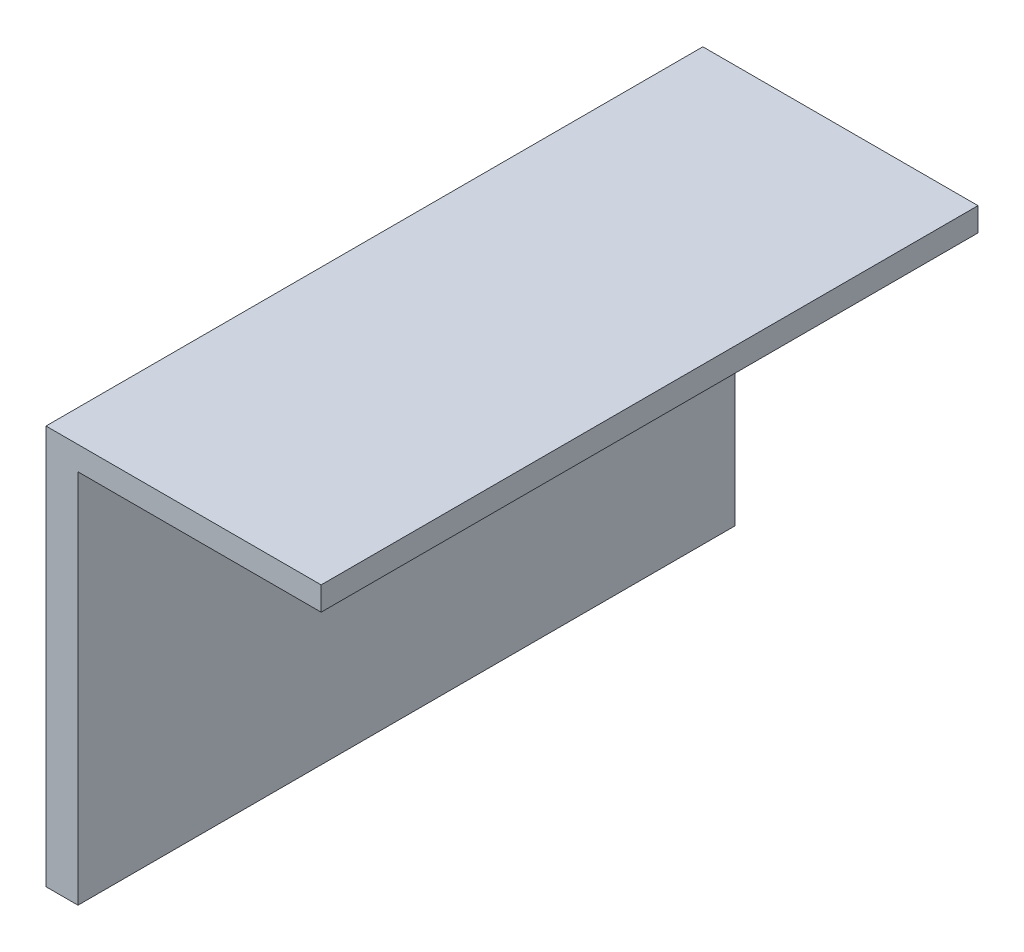
ISO-10303-21;
HEADER;
FILE_DESCRIPTION(('STEP AP214'),'2;1');
FILE_NAME('part.step','',(''),(''),'','','');
FILE_SCHEMA(('AUTOMOTIVE_DESIGN { 1 0 10303 214 1 1 1 1 }'));
ENDSEC;
DATA;
#1=APPLICATION_CONTEXT('core data for automotive mechanical design processes');
#2=APPLICATION_PROTOCOL_DEFINITION('international standard','automotive_design',2000,#1);
#3=PRODUCT_CONTEXT('',#1,'mechanical');
#4=PRODUCT('Part','Part','',(#3));
#5=PRODUCT_RELATED_PRODUCT_CATEGORY('part','',(#4));
#6=PRODUCT_DEFINITION_FORMATION('','',#4);
#7=PRODUCT_DEFINITION_CONTEXT('part definition',#1,'design');
#8=PRODUCT_DEFINITION('design','',#6,#7);
#9=PRODUCT_DEFINITION_SHAPE('','',#8);
#10=(LENGTH_UNIT() NAMED_UNIT(*) SI_UNIT(.MILLI.,.METRE.));
#11=(NAMED_UNIT(*) PLANE_ANGLE_UNIT() SI_UNIT($,.RADIAN.));
#12=(NAMED_UNIT(*) SI_UNIT($,.STERADIAN.) SOLID_ANGLE_UNIT());
#13=UNCERTAINTY_MEASURE_WITH_UNIT(LENGTH_MEASURE(1.E-05),#10,'distance_accuracy_value','');
#14=(GEOMETRIC_REPRESENTATION_CONTEXT(3) GLOBAL_UNCERTAINTY_ASSIGNED_CONTEXT((#13)) GLOBAL_UNIT_ASSIGNED_CONTEXT((#10,
#11,#12)) REPRESENTATION_CONTEXT('',''));
#15=CARTESIAN_POINT('',(0.,0.,0.));
#16=DIRECTION('',(0.,0.,1.));
#17=DIRECTION('',(1.,0.,0.));
#18=AXIS2_PLACEMENT_3D('',#15,#16,#17);
#19=CARTESIAN_POINT('',(2.54,-13.2993357801751,50.0268182689161));
#20=DIRECTION('',(0.,0.,-1.));
#21=DIRECTION('',(-1.,0.,0.));
#22=AXIS2_PLACEMENT_3D('',#19,#20,#21);
#23=PLANE('',#22);
#24=DIRECTION('',(0.,-1.,0.));
#25=VECTOR('',#24,1.);
#26=CARTESIAN_POINT('',(0.,-13.2993357801751,50.0268182689161));
#27=LINE('',#26,#25);
#28=CARTESIAN_POINT('',(0.,18.3793357798595,50.0268182689161));
#29=VERTEX_POINT('',#28);
#30=CARTESIAN_POINT('',(0.,-13.2993357801751,50.0268182689161));
#31=VERTEX_POINT('',#30);
#32=EDGE_CURVE('E97',#29,#31,#27,.T.);
#33=ORIENTED_EDGE('',*,*,#32,.T.);
#34=DIRECTION('',(-1.,0.,0.));
#35=VECTOR('',#34,1.);
#36=CARTESIAN_POINT('',(2.54,-13.2993357801751,50.0268182689161));
#37=LINE('',#36,#35);
#38=CARTESIAN_POINT('',(2.54,-13.2993357801751,50.0268182689161));
#39=VERTEX_POINT('',#38);
#40=EDGE_CURVE('E11',#39,#31,#37,.T.);
#41=ORIENTED_EDGE('',*,*,#40,.F.);
#42=DIRECTION('',(0.,-1.,0.));
#43=VECTOR('',#42,1.);
#44=CARTESIAN_POINT('',(2.54,-13.2993357801751,50.0268182689161));
#45=LINE('',#44,#43);
#46=CARTESIAN_POINT('',(2.54,16.5011553694942,50.0268182689161));
#47=VERTEX_POINT('',#46);
#48=EDGE_CURVE('E90',#47,#39,#45,.T.);
#49=ORIENTED_EDGE('',*,*,#48,.F.);
#50=DIRECTION('',(-1.,0.,0.));
#51=VECTOR('',#50,1.);
#52=CARTESIAN_POINT('',(21.844,16.5011553694942,50.0268182689161));
#53=LINE('',#52,#51);
#54=CARTESIAN_POINT('',(21.844,16.5011553694942,50.0268182689161));
#55=VERTEX_POINT('',#54);
#56=EDGE_CURVE('E107',#55,#47,#53,.T.);
#57=ORIENTED_EDGE('',*,*,#56,.F.);
#58=DIRECTION('',(0.,-1.,0.));
#59=VECTOR('',#58,1.);
#60=CARTESIAN_POINT('',(21.844,18.3793357798595,50.0268182689161));
#61=LINE('',#60,#59);
#62=CARTESIAN_POINT('',(21.844,18.3793357798595,50.0268182689161));
#63=VERTEX_POINT('',#62);
#64=EDGE_CURVE('E100',#63,#55,#61,.T.);
#65=ORIENTED_EDGE('',*,*,#64,.F.);
#66=DIRECTION('',(-1.,0.,0.));
#67=VECTOR('',#66,1.);
#68=CARTESIAN_POINT('',(2.54,18.3793357798595,50.0268182689161));
#69=LINE('',#68,#67);
#70=EDGE_CURVE('E82',#63,#29,#69,.T.);
#71=ORIENTED_EDGE('',*,*,#70,.T.);
#72=EDGE_LOOP('',(#33,#41,#49,#57,#65,#71));
#73=FACE_BOUND('',#72,.T.);
#74=ADVANCED_FACE('F37',(#73),#23,.F.);
#75=CARTESIAN_POINT('',(2.54,-13.2993357801751,-2.12253055855477));
#76=DIRECTION('',(0.,1.,0.));
#77=DIRECTION('',(0.,0.,1.));
#78=AXIS2_PLACEMENT_3D('',#75,#76,#77);
#79=PLANE('',#78);
#80=DIRECTION('',(0.,0.,-1.));
#81=VECTOR('',#80,1.);
#82=CARTESIAN_POINT('',(0.,-13.2993357801751,-2.12253055855477));
#83=LINE('',#82,#81);
#84=CARTESIAN_POINT('',(0.,-13.2993357801751,-2.12253055855477));
#85=VERTEX_POINT('',#84);
#86=EDGE_CURVE('E105',#31,#85,#83,.T.);
#87=ORIENTED_EDGE('',*,*,#86,.T.);
#88=DIRECTION('',(-1.,0.,0.));
#89=VECTOR('',#88,1.);
#90=CARTESIAN_POINT('',(2.54,-13.2993357801751,-2.12253055855477));
#91=LINE('',#90,#89);
#92=CARTESIAN_POINT('',(2.54,-13.2993357801751,-2.12253055855477));
#93=VERTEX_POINT('',#92);
#94=EDGE_CURVE('E45',#93,#85,#91,.T.);
#95=ORIENTED_EDGE('',*,*,#94,.F.);
#96=DIRECTION('',(0.,0.,-1.));
#97=VECTOR('',#96,1.);
#98=CARTESIAN_POINT('',(2.54,-13.2993357801751,-2.12253055855477));
#99=LINE('',#98,#97);
#100=EDGE_CURVE('E58',#39,#93,#99,.T.);
#101=ORIENTED_EDGE('',*,*,#100,.F.);
#102=ORIENTED_EDGE('',*,*,#40,.T.);
#103=EDGE_LOOP('',(#87,#95,#101,#102));
#104=FACE_BOUND('',#103,.T.);
#105=ADVANCED_FACE('F130',(#104),#79,.F.);
#106=CARTESIAN_POINT('',(2.54,-13.2993357801751,-2.12253055855477));
#107=DIRECTION('',(0.,0.,1.));
#108=DIRECTION('',(1.,0.,0.));
#109=AXIS2_PLACEMENT_3D('',#106,#107,#108);
#110=PLANE('',#109);
#111=DIRECTION('',(0.,1.,0.));
#112=VECTOR('',#111,1.);
#113=CARTESIAN_POINT('',(0.,-13.2993357801751,-2.12253055855477));
#114=LINE('',#113,#112);
#115=CARTESIAN_POINT('',(0.,18.3793357798595,-2.12253055855477));
#116=VERTEX_POINT('',#115);
#117=EDGE_CURVE('E91',#85,#116,#114,.T.);
#118=ORIENTED_EDGE('',*,*,#117,.T.);
#119=DIRECTION('',(-1.,0.,0.));
#120=VECTOR('',#119,1.);
#121=CARTESIAN_POINT('',(2.54,18.3793357798595,-2.12253055855477));
#122=LINE('',#121,#120);
#123=CARTESIAN_POINT('',(21.844,18.3793357798595,-2.12253055855477));
#124=VERTEX_POINT('',#123);
#125=EDGE_CURVE('E85',#124,#116,#122,.T.);
#126=ORIENTED_EDGE('',*,*,#125,.F.);
#127=DIRECTION('',(0.,1.,0.));
#128=VECTOR('',#127,1.);
#129=CARTESIAN_POINT('',(21.844,18.3793357798595,-2.12253055855477));
#130=LINE('',#129,#128);
#131=CARTESIAN_POINT('',(21.844,16.5011553694942,-2.12253055855477));
#132=VERTEX_POINT('',#131);
#133=EDGE_CURVE('E147',#132,#124,#130,.T.);
#134=ORIENTED_EDGE('',*,*,#133,.F.);
#135=DIRECTION('',(-1.,0.,0.));
#136=VECTOR('',#135,1.);
#137=CARTESIAN_POINT('',(21.844,16.5011553694942,-2.12253055855477));
#138=LINE('',#137,#136);
#139=CARTESIAN_POINT('',(2.54,16.5011553694942,-2.12253055855477));
#140=VERTEX_POINT('',#139);
#141=EDGE_CURVE('E114',#132,#140,#138,.T.);
#142=ORIENTED_EDGE('',*,*,#141,.T.);
#143=DIRECTION('',(0.,1.,0.));
#144=VECTOR('',#143,1.);
#145=CARTESIAN_POINT('',(2.54,-13.2993357801751,-2.12253055855477));
#146=LINE('',#145,#144);
#147=EDGE_CURVE('E102',#93,#140,#146,.T.);
#148=ORIENTED_EDGE('',*,*,#147,.F.);
#149=ORIENTED_EDGE('',*,*,#94,.T.);
#150=EDGE_LOOP('',(#118,#126,#134,#142,#148,#149));
#151=FACE_BOUND('',#150,.T.);
#152=ADVANCED_FACE('F127',(#151),#110,.F.);
#153=CARTESIAN_POINT('',(2.54,18.3793357798595,-2.12253055855477));
#154=DIRECTION('',(0.,-1.,0.));
#155=DIRECTION('',(0.,0.,-1.));
#156=AXIS2_PLACEMENT_3D('',#153,#154,#155);
#157=PLANE('',#156);
#158=DIRECTION('',(0.,0.,1.));
#159=VECTOR('',#158,1.);
#160=CARTESIAN_POINT('',(0.,18.3793357798595,-2.12253055855477));
#161=LINE('',#160,#159);
#162=EDGE_CURVE('E78',#116,#29,#161,.T.);
#163=ORIENTED_EDGE('',*,*,#162,.T.);
#164=ORIENTED_EDGE('',*,*,#70,.F.);
#165=DIRECTION('',(0.,0.,1.));
#166=VECTOR('',#165,1.);
#167=CARTESIAN_POINT('',(21.844,18.3793357798595,50.0268182689161));
#168=LINE('',#167,#166);
#169=EDGE_CURVE('E150',#124,#63,#168,.T.);
#170=ORIENTED_EDGE('',*,*,#169,.F.);
#171=ORIENTED_EDGE('',*,*,#125,.T.);
#172=EDGE_LOOP('',(#163,#164,#170,#171));
#173=FACE_BOUND('',#172,.T.);
#174=ADVANCED_FACE('F80',(#173),#157,.F.);
#175=CARTESIAN_POINT('',(2.54,0.,0.));
#176=DIRECTION('',(1.,0.,0.));
#177=DIRECTION('',(0.,0.,-1.));
#178=AXIS2_PLACEMENT_3D('',#175,#176,#177);
#179=PLANE('',#178);
#180=DIRECTION('',(0.,0.,-1.));
#181=VECTOR('',#180,1.);
#182=CARTESIAN_POINT('',(2.54,16.5011553694942,50.0268182689161));
#183=LINE('',#182,#181);
#184=EDGE_CURVE('E52',#47,#140,#183,.T.);
#185=ORIENTED_EDGE('',*,*,#184,.F.);
#186=ORIENTED_EDGE('',*,*,#48,.T.);
#187=ORIENTED_EDGE('',*,*,#100,.T.);
#188=ORIENTED_EDGE('',*,*,#147,.T.);
#189=EDGE_LOOP('',(#185,#186,#187,#188));
#190=FACE_BOUND('',#189,.T.);
#191=ADVANCED_FACE('F166',(#190),#179,.T.);
#192=CARTESIAN_POINT('',(0.,0.,0.));
#193=DIRECTION('',(1.,0.,0.));
#194=DIRECTION('',(0.,0.,-1.));
#195=AXIS2_PLACEMENT_3D('',#192,#193,#194);
#196=PLANE('',#195);
#197=ORIENTED_EDGE('',*,*,#32,.F.);
#198=ORIENTED_EDGE('',*,*,#162,.F.);
#199=ORIENTED_EDGE('',*,*,#117,.F.);
#200=ORIENTED_EDGE('',*,*,#86,.F.);
#201=EDGE_LOOP('',(#197,#198,#199,#200));
#202=FACE_BOUND('',#201,.T.);
#203=ADVANCED_FACE('F104',(#202),#196,.F.);
#204=CARTESIAN_POINT('',(21.844,16.5011553694942,50.0268182689161));
#205=DIRECTION('',(0.,1.,0.));
#206=DIRECTION('',(0.,0.,1.));
#207=AXIS2_PLACEMENT_3D('',#204,#205,#206);
#208=PLANE('',#207);
#209=ORIENTED_EDGE('',*,*,#184,.T.);
#210=ORIENTED_EDGE('',*,*,#141,.F.);
#211=DIRECTION('',(0.,0.,-1.));
#212=VECTOR('',#211,1.);
#213=CARTESIAN_POINT('',(21.844,16.5011553694942,50.0268182689161));
#214=LINE('',#213,#212);
#215=EDGE_CURVE('E140',#55,#132,#214,.T.);
#216=ORIENTED_EDGE('',*,*,#215,.F.);
#217=ORIENTED_EDGE('',*,*,#56,.T.);
#218=EDGE_LOOP('',(#209,#210,#216,#217));
#219=FACE_BOUND('',#218,.T.);
#220=ADVANCED_FACE('F136',(#219),#208,.F.);
#221=CARTESIAN_POINT('',(21.844,0.,0.));
#222=DIRECTION('',(1.,0.,0.));
#223=DIRECTION('',(0.,0.,-1.));
#224=AXIS2_PLACEMENT_3D('',#221,#222,#223);
#225=PLANE('',#224);
#226=ORIENTED_EDGE('',*,*,#64,.T.);
#227=ORIENTED_EDGE('',*,*,#215,.T.);
#228=ORIENTED_EDGE('',*,*,#133,.T.);
#229=ORIENTED_EDGE('',*,*,#169,.T.);
#230=EDGE_LOOP('',(#226,#227,#228,#229));
#231=FACE_BOUND('',#230,.T.);
#232=ADVANCED_FACE('F149',(#231),#225,.T.);
#233=CLOSED_SHELL('',(#74,#105,#152,#174,#191,#203,#220,#232));
#234=MANIFOLD_SOLID_BREP('B2',#233);
#235=ADVANCED_BREP_SHAPE_REPRESENTATION('',(#18,#234),#14);
#236=SHAPE_DEFINITION_REPRESENTATION(#9,#235);
ENDSEC;
END-ISO-10303-21;
